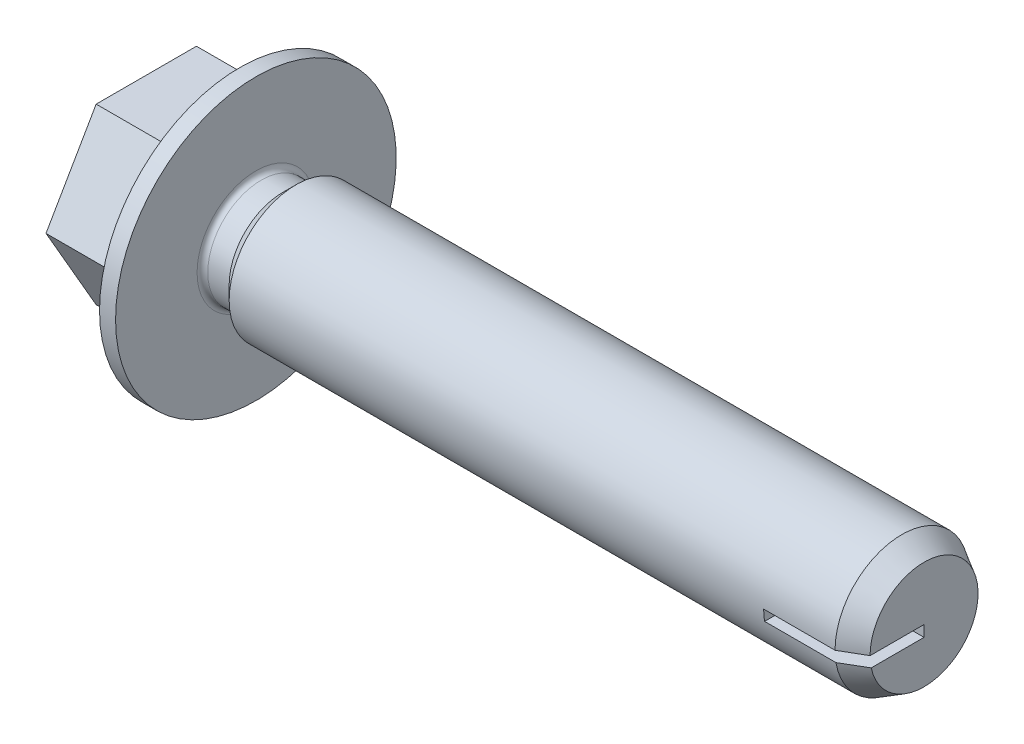
ISO-10303-21;
HEADER;
FILE_DESCRIPTION(('STEP AP214'),'2;1');
FILE_NAME('part.step','',(''),(''),'','','');
FILE_SCHEMA(('AUTOMOTIVE_DESIGN { 1 0 10303 214 1 1 1 1 }'));
ENDSEC;
DATA;
#1=APPLICATION_CONTEXT('core data for automotive mechanical design processes');
#2=APPLICATION_PROTOCOL_DEFINITION('international standard','automotive_design',2000,#1);
#3=PRODUCT_CONTEXT('',#1,'mechanical');
#4=PRODUCT('Part','Part','',(#3));
#5=PRODUCT_RELATED_PRODUCT_CATEGORY('part','',(#4));
#6=PRODUCT_DEFINITION_FORMATION('','',#4);
#7=PRODUCT_DEFINITION_CONTEXT('part definition',#1,'design');
#8=PRODUCT_DEFINITION('design','',#6,#7);
#9=PRODUCT_DEFINITION_SHAPE('','',#8);
#10=(LENGTH_UNIT() NAMED_UNIT(*) SI_UNIT(.MILLI.,.METRE.));
#11=(NAMED_UNIT(*) PLANE_ANGLE_UNIT() SI_UNIT($,.RADIAN.));
#12=(NAMED_UNIT(*) SI_UNIT($,.STERADIAN.) SOLID_ANGLE_UNIT());
#13=UNCERTAINTY_MEASURE_WITH_UNIT(LENGTH_MEASURE(1.E-05),#10,'distance_accuracy_value','');
#14=(GEOMETRIC_REPRESENTATION_CONTEXT(3) GLOBAL_UNCERTAINTY_ASSIGNED_CONTEXT((#13)) GLOBAL_UNIT_ASSIGNED_CONTEXT((#10,
#11,#12)) REPRESENTATION_CONTEXT('',''));
#15=CARTESIAN_POINT('',(0.,0.,0.));
#16=DIRECTION('',(0.,0.,1.));
#17=DIRECTION('',(1.,0.,0.));
#18=AXIS2_PLACEMENT_3D('',#15,#16,#17);
#19=CARTESIAN_POINT('',(0.,0.,0.));
#20=DIRECTION('',(-1.,0.,0.));
#21=DIRECTION('',(0.,0.,1.));
#22=AXIS2_PLACEMENT_3D('',#19,#20,#21);
#23=CYLINDRICAL_SURFACE('',#22,5.00000000000001);
#24=CARTESIAN_POINT('',(3.,0.,0.));
#25=DIRECTION('',(-1.,0.,0.));
#26=DIRECTION('',(0.,0.,1.));
#27=AXIS2_PLACEMENT_3D('',#24,#25,#26);
#28=CIRCLE('',#27,5.);
#29=CARTESIAN_POINT('',(3.,0.,5.));
#30=VERTEX_POINT('',#29);
#31=EDGE_CURVE('E257',#30,#30,#28,.T.);
#32=ORIENTED_EDGE('',*,*,#31,.F.);
#33=EDGE_LOOP('',(#32));
#34=FACE_BOUND('',#33,.T.);
#35=DIRECTION('',(-1.,0.,0.));
#36=VECTOR('',#35,1.);
#37=CARTESIAN_POINT('',(0.,0.,5.00000000000001));
#38=LINE('',#37,#36);
#39=CARTESIAN_POINT('',(48.3372312247338,0.,5.));
#40=VERTEX_POINT('',#39);
#41=CARTESIAN_POINT('',(43.,0.,5.00000000000001));
#42=VERTEX_POINT('',#41);
#43=EDGE_CURVE('E393',#40,#42,#38,.T.);
#44=ORIENTED_EDGE('',*,*,#43,.F.);
#45=CARTESIAN_POINT('',(48.3372312247338,0.,0.));
#46=DIRECTION('',(-1.,0.,0.));
#47=DIRECTION('',(0.,0.,1.));
#48=AXIS2_PLACEMENT_3D('',#45,#46,#47);
#49=CIRCLE('',#48,5.);
#50=CARTESIAN_POINT('',(48.3372312247338,-0.833333333333333,4.93006648591635));
#51=VERTEX_POINT('',#50);
#52=EDGE_CURVE('E388',#40,#51,#49,.T.);
#53=ORIENTED_EDGE('',*,*,#52,.T.);
#54=DIRECTION('',(-1.,0.,0.));
#55=VECTOR('',#54,1.);
#56=CARTESIAN_POINT('',(0.,-0.833333333333339,4.93006648591635));
#57=LINE('',#56,#55);
#58=CARTESIAN_POINT('',(43.,-0.833333333333334,4.93006648591636));
#59=VERTEX_POINT('',#58);
#60=EDGE_CURVE('E397',#59,#51,#57,.F.);
#61=ORIENTED_EDGE('',*,*,#60,.F.);
#62=CARTESIAN_POINT('',(43.,0.,0.));
#63=DIRECTION('',(1.,0.,0.));
#64=DIRECTION('',(0.,0.,-1.));
#65=AXIS2_PLACEMENT_3D('',#62,#63,#64);
#66=CIRCLE('',#65,5.00000000000001);
#67=EDGE_CURVE('E126',#42,#59,#66,.T.);
#68=ORIENTED_EDGE('',*,*,#67,.F.);
#69=EDGE_LOOP('',(#44,#53,#61,#68));
#70=FACE_BOUND('',#69,.T.);
#71=ADVANCED_FACE('F153',(#34,#70),#23,.T.);
#72=CARTESIAN_POINT('',(48.3372312247338,0.,0.));
#73=DIRECTION('',(-1.,0.,0.));
#74=DIRECTION('',(0.,0.,1.));
#75=AXIS2_PLACEMENT_3D('',#72,#73,#74);
#76=CONICAL_SURFACE('',#75,5.,0.523598775598293);
#77=ORIENTED_EDGE('',*,*,#52,.F.);
#78=DIRECTION('',(-0.866025403784442,0.,0.499999999999995));
#79=VECTOR('',#78,1.);
#80=CARTESIAN_POINT('',(56.9974852625784,0.,0.));
#81=LINE('',#80,#79);
#82=CARTESIAN_POINT('',(50.,0.,4.04));
#83=VERTEX_POINT('',#82);
#84=EDGE_CURVE('E395',#40,#83,#81,.F.);
#85=ORIENTED_EDGE('',*,*,#84,.T.);
#86=CARTESIAN_POINT('',(50.,0.,0.));
#87=DIRECTION('',(-1.,0.,0.));
#88=DIRECTION('',(0.,0.,1.));
#89=AXIS2_PLACEMENT_3D('',#86,#87,#88);
#90=CIRCLE('',#89,4.04);
#91=CARTESIAN_POINT('',(50.,-0.833333333333333,3.95311972441458));
#92=VERTEX_POINT('',#91);
#93=EDGE_CURVE('E255',#83,#92,#90,.T.);
#94=ORIENTED_EDGE('',*,*,#93,.T.);
#95=CARTESIAN_POINT('',(54.3247639619559,-0.833333333333332,1.29873089558837));
#96=CARTESIAN_POINT('',(54.2539941704602,-0.833333333333332,1.34725537138206));
#97=CARTESIAN_POINT('',(54.1828785114112,-0.833333333333332,1.39526964887625));
#98=CARTESIAN_POINT('',(54.0401016315832,-0.833333333333332,1.49047344700938));
#99=CARTESIAN_POINT('',(53.9684404371539,-0.833333333333333,1.53766300712429));
#100=CARTESIAN_POINT('',(53.8247211543455,-0.833333333333333,1.63141155391442));
#101=CARTESIAN_POINT('',(53.752663118618,-0.833333333333333,1.67797062153481));
#102=CARTESIAN_POINT('',(53.6082258623107,-0.833333333333333,1.77058968692906));
#103=CARTESIAN_POINT('',(53.5358466372734,-0.833333333333333,1.81664967774571));
#104=CARTESIAN_POINT('',(53.3183642112331,-0.833333333333333,1.95421200872291));
#105=CARTESIAN_POINT('',(53.1728838142965,-0.833333333333333,2.04511773162646));
#106=CARTESIAN_POINT('',(52.8812495364593,-0.833333333333333,2.22585256137803));
#107=CARTESIAN_POINT('',(52.7350956278255,-0.833333333333333,2.31568162333398));
#108=CARTESIAN_POINT('',(52.3080852699756,-0.833333333333333,2.57660770394159));
#109=CARTESIAN_POINT('',(52.026608833395,-0.833333333333333,2.74668927298442));
#110=CARTESIAN_POINT('',(51.4627141115084,-0.833333333333333,3.08527145364158));
#111=CARTESIAN_POINT('',(51.1802958355546,-0.833333333333333,3.25377208089117));
#112=CARTESIAN_POINT('',(50.6148051769543,-0.833333333333333,3.58980112792525));
#113=CARTESIAN_POINT('',(50.3317326746538,-0.833333333333333,3.7573293462797));
#114=CARTESIAN_POINT('',(49.7651904009645,-0.833333333333333,4.09171283682867));
#115=CARTESIAN_POINT('',(49.4817206290751,-0.833333333333333,4.2585681081745));
#116=CARTESIAN_POINT('',(48.7666378111783,-0.833333333333333,4.67868104235534));
#117=CARTESIAN_POINT('',(48.3348433243252,-0.833333333333333,4.93162979117259));
#118=CARTESIAN_POINT('',(47.4708588506733,-0.833333333333333,5.43685048612455));
#119=CARTESIAN_POINT('',(47.038668863839,-0.833333333333333,5.68912243219863));
#120=CARTESIAN_POINT('',(46.174190792108,-0.833333333333334,6.19311639762207));
#121=CARTESIAN_POINT('',(45.7419028086198,-0.833333333333334,6.44483859095241));
#122=CARTESIAN_POINT('',(44.8771371202499,-0.833333333333334,6.94795546546835));
#123=CARTESIAN_POINT('',(44.4446594156462,-0.833333333333334,7.19935014713161));
#124=CARTESIAN_POINT('',(44.0121233168639,-0.833333333333334,7.45064407792756));
#125=B_SPLINE_CURVE_WITH_KNOTS('',3,(#95,#96,#97,#98,#99,#100,#101,#102,#103,#104,#105,#106,
#107,#108,#109,#110,#111,#112,#113,#114,#115,#116,#117,#118,#119,#120,#121,#122,#123,#124),
.UNSPECIFIED.,.F.,.F.,(4,2,2,2,2,2,2,2,2,2,2,2,2,2,4),(0.,0.257416666427779,0.514820977404485,
0.772191922352455,1.0295664504941,1.54419953035658,2.05885399404563,3.04545828859048,
4.03205281546699,5.01884489709277,6.00563822283813,7.50692516636697,9.00821224437488,
10.5089227938863,12.0096311523225),.UNSPECIFIED.);
#126=EDGE_CURVE('E399',#92,#51,#125,.T.);
#127=ORIENTED_EDGE('',*,*,#126,.T.);
#128=EDGE_LOOP('',(#77,#85,#94,#127));
#129=FACE_BOUND('',#128,.T.);
#130=ADVANCED_FACE('F407',(#129),#76,.T.);
#131=CARTESIAN_POINT('',(50.,5.00000000000001,0.));
#132=DIRECTION('',(-1.,0.,0.));
#133=DIRECTION('',(0.,0.,1.));
#134=AXIS2_PLACEMENT_3D('',#131,#132,#133);
#135=PLANE('',#134);
#136=DIRECTION('',(0.,0.,1.));
#137=VECTOR('',#136,1.);
#138=CARTESIAN_POINT('',(50.,0.,0.));
#139=LINE('',#138,#137);
#140=CARTESIAN_POINT('',(50.,0.,0.));
#141=VERTEX_POINT('',#140);
#142=EDGE_CURVE('E161',#141,#83,#139,.T.);
#143=ORIENTED_EDGE('',*,*,#142,.F.);
#144=DIRECTION('',(0.,1.,0.));
#145=VECTOR('',#144,1.);
#146=CARTESIAN_POINT('',(50.,0.,0.));
#147=LINE('',#146,#145);
#148=CARTESIAN_POINT('',(50.,-0.833333333333334,0.));
#149=VERTEX_POINT('',#148);
#150=EDGE_CURVE('E245',#149,#141,#147,.T.);
#151=ORIENTED_EDGE('',*,*,#150,.F.);
#152=DIRECTION('',(0.,0.,-1.));
#153=VECTOR('',#152,1.);
#154=CARTESIAN_POINT('',(50.,-0.833333333333333,0.));
#155=LINE('',#154,#153);
#156=EDGE_CURVE('E256',#92,#149,#155,.T.);
#157=ORIENTED_EDGE('',*,*,#156,.F.);
#158=ORIENTED_EDGE('',*,*,#93,.F.);
#159=EDGE_LOOP('',(#143,#151,#157,#158));
#160=FACE_BOUND('',#159,.T.);
#161=ADVANCED_FACE('F253',(#160),#135,.F.);
#162=CARTESIAN_POINT('',(-8.2,6.5,0.));
#163=DIRECTION('',(1.,0.,0.));
#164=DIRECTION('',(0.,0.,-1.));
#165=AXIS2_PLACEMENT_3D('',#162,#163,#164);
#166=PLANE('',#165);
#167=DIRECTION('',(0.,-0.866025403784439,-0.5));
#168=VECTOR('',#167,1.);
#169=CARTESIAN_POINT('',(-8.2,3.25,-5.62916512459885));
#170=LINE('',#169,#168);
#171=CARTESIAN_POINT('',(-8.2,6.5,-3.75277674973257));
#172=VERTEX_POINT('',#171);
#173=CARTESIAN_POINT('',(-8.2,0.,-7.50555349946513));
#174=VERTEX_POINT('',#173);
#175=EDGE_CURVE('E280',#172,#174,#170,.T.);
#176=ORIENTED_EDGE('',*,*,#175,.T.);
#177=DIRECTION('',(0.,-0.866025403784439,0.5));
#178=VECTOR('',#177,1.);
#179=CARTESIAN_POINT('',(-8.2,-3.25,-5.62916512459885));
#180=LINE('',#179,#178);
#181=CARTESIAN_POINT('',(-8.2,-6.5,-3.75277674973257));
#182=VERTEX_POINT('',#181);
#183=EDGE_CURVE('E354',#174,#182,#180,.T.);
#184=ORIENTED_EDGE('',*,*,#183,.T.);
#185=DIRECTION('',(0.,0.,1.));
#186=VECTOR('',#185,1.);
#187=CARTESIAN_POINT('',(-8.2,-6.5,0.));
#188=LINE('',#187,#186);
#189=CARTESIAN_POINT('',(-8.2,-6.5,3.75277674973257));
#190=VERTEX_POINT('',#189);
#191=EDGE_CURVE('E383',#182,#190,#188,.T.);
#192=ORIENTED_EDGE('',*,*,#191,.T.);
#193=DIRECTION('',(0.,0.866025403784439,0.5));
#194=VECTOR('',#193,1.);
#195=CARTESIAN_POINT('',(-8.2,-6.5,3.75277674973257));
#196=LINE('',#195,#194);
#197=CARTESIAN_POINT('',(-8.2,0.,7.50555349946513));
#198=VERTEX_POINT('',#197);
#199=EDGE_CURVE('E352',#190,#198,#196,.T.);
#200=ORIENTED_EDGE('',*,*,#199,.T.);
#201=DIRECTION('',(0.,0.866025403784439,-0.5));
#202=VECTOR('',#201,1.);
#203=CARTESIAN_POINT('',(-8.2,0.,7.50555349946513));
#204=LINE('',#203,#202);
#205=CARTESIAN_POINT('',(-8.2,6.5,3.75277674973257));
#206=VERTEX_POINT('',#205);
#207=EDGE_CURVE('E322',#198,#206,#204,.T.);
#208=ORIENTED_EDGE('',*,*,#207,.T.);
#209=DIRECTION('',(0.,0.,-1.));
#210=VECTOR('',#209,1.);
#211=CARTESIAN_POINT('',(-8.2,6.5,0.));
#212=LINE('',#211,#210);
#213=EDGE_CURVE('E277',#206,#172,#212,.T.);
#214=ORIENTED_EDGE('',*,*,#213,.T.);
#215=EDGE_LOOP('',(#176,#184,#192,#200,#208,#214));
#216=FACE_BOUND('',#215,.T.);
#217=ADVANCED_FACE('F155',(#216),#166,.F.);
#218=CARTESIAN_POINT('',(3.,0.,0.));
#219=DIRECTION('',(1.,0.,0.));
#220=DIRECTION('',(0.,0.,-1.));
#221=AXIS2_PLACEMENT_3D('',#218,#219,#220);
#222=CONICAL_SURFACE('',#221,5.,0.785398163397449);
#223=CARTESIAN_POINT('',(2.,0.,0.));
#224=DIRECTION('',(-1.,0.,0.));
#225=DIRECTION('',(0.,0.,1.));
#226=AXIS2_PLACEMENT_3D('',#223,#224,#225);
#227=CIRCLE('',#226,4.);
#228=CARTESIAN_POINT('',(2.,0.,4.));
#229=VERTEX_POINT('',#228);
#230=EDGE_CURVE('E262',#229,#229,#227,.T.);
#231=ORIENTED_EDGE('',*,*,#230,.F.);
#232=EDGE_LOOP('',(#231));
#233=FACE_BOUND('',#232,.T.);
#234=ORIENTED_EDGE('',*,*,#31,.T.);
#235=EDGE_LOOP('',(#234));
#236=FACE_BOUND('',#235,.T.);
#237=ADVANCED_FACE('F432',(#233,#236),#222,.T.);
#238=CARTESIAN_POINT('',(0.,0.,0.));
#239=DIRECTION('',(-1.,0.,0.));
#240=DIRECTION('',(0.,0.,1.));
#241=AXIS2_PLACEMENT_3D('',#238,#239,#240);
#242=CYLINDRICAL_SURFACE('',#241,4.);
#243=CARTESIAN_POINT('',(0.4,0.,0.));
#244=DIRECTION('',(-1.,0.,0.));
#245=DIRECTION('',(0.,0.,1.));
#246=AXIS2_PLACEMENT_3D('',#243,#244,#245);
#247=CIRCLE('',#246,4.);
#248=CARTESIAN_POINT('',(0.4,0.,4.));
#249=VERTEX_POINT('',#248);
#250=EDGE_CURVE('E265',#249,#249,#247,.T.);
#251=ORIENTED_EDGE('',*,*,#250,.F.);
#252=EDGE_LOOP('',(#251));
#253=FACE_BOUND('',#252,.T.);
#254=ORIENTED_EDGE('',*,*,#230,.T.);
#255=EDGE_LOOP('',(#254));
#256=FACE_BOUND('',#255,.T.);
#257=ADVANCED_FACE('F441',(#253,#256),#242,.T.);
#258=CARTESIAN_POINT('',(0.4,0.,0.));
#259=DIRECTION('',(-1.,0.,0.));
#260=DIRECTION('',(0.,0.,1.));
#261=AXIS2_PLACEMENT_3D('',#258,#259,#260);
#262=TOROIDAL_SURFACE('',#261,4.4,0.4);
#263=CARTESIAN_POINT('',(0.,0.,0.));
#264=DIRECTION('',(-1.,0.,0.));
#265=DIRECTION('',(0.,0.,1.));
#266=AXIS2_PLACEMENT_3D('',#263,#264,#265);
#267=CIRCLE('',#266,4.4);
#268=CARTESIAN_POINT('',(0.,0.,4.4));
#269=VERTEX_POINT('',#268);
#270=EDGE_CURVE('E268',#269,#269,#267,.T.);
#271=ORIENTED_EDGE('',*,*,#270,.F.);
#272=EDGE_LOOP('',(#271));
#273=FACE_BOUND('',#272,.T.);
#274=ORIENTED_EDGE('',*,*,#250,.T.);
#275=EDGE_LOOP('',(#274));
#276=FACE_BOUND('',#275,.T.);
#277=ADVANCED_FACE('F446',(#273,#276),#262,.F.);
#278=CARTESIAN_POINT('',(0.,10.5,0.));
#279=DIRECTION('',(-1.,0.,0.));
#280=DIRECTION('',(0.,0.,1.));
#281=AXIS2_PLACEMENT_3D('',#278,#279,#280);
#282=PLANE('',#281);
#283=CARTESIAN_POINT('',(0.,0.,0.));
#284=DIRECTION('',(-1.,0.,0.));
#285=DIRECTION('',(0.,0.,1.));
#286=AXIS2_PLACEMENT_3D('',#283,#284,#285);
#287=CIRCLE('',#286,10.5);
#288=CARTESIAN_POINT('',(0.,0.,10.5));
#289=VERTEX_POINT('',#288);
#290=EDGE_CURVE('E271',#289,#289,#287,.T.);
#291=ORIENTED_EDGE('',*,*,#290,.F.);
#292=EDGE_LOOP('',(#291));
#293=FACE_BOUND('',#292,.T.);
#294=ORIENTED_EDGE('',*,*,#270,.T.);
#295=EDGE_LOOP('',(#294));
#296=FACE_BOUND('',#295,.T.);
#297=ADVANCED_FACE('F454',(#293,#296),#282,.F.);
#298=CARTESIAN_POINT('',(0.,0.,0.));
#299=DIRECTION('',(-1.,0.,0.));
#300=DIRECTION('',(0.,0.,1.));
#301=AXIS2_PLACEMENT_3D('',#298,#299,#300);
#302=CYLINDRICAL_SURFACE('',#301,10.5);
#303=CARTESIAN_POINT('',(-1.2,0.,0.));
#304=DIRECTION('',(-1.,0.,0.));
#305=DIRECTION('',(0.,0.,1.));
#306=AXIS2_PLACEMENT_3D('',#303,#304,#305);
#307=CIRCLE('',#306,10.5);
#308=CARTESIAN_POINT('',(-1.2,0.,10.5));
#309=VERTEX_POINT('',#308);
#310=EDGE_CURVE('E274',#309,#309,#307,.T.);
#311=ORIENTED_EDGE('',*,*,#310,.F.);
#312=EDGE_LOOP('',(#311));
#313=FACE_BOUND('',#312,.T.);
#314=ORIENTED_EDGE('',*,*,#290,.T.);
#315=EDGE_LOOP('',(#314));
#316=FACE_BOUND('',#315,.T.);
#317=ADVANCED_FACE('F461',(#313,#316),#302,.T.);
#318=CARTESIAN_POINT('',(-1.2,0.,0.));
#319=DIRECTION('',(1.,0.,0.));
#320=DIRECTION('',(0.,0.,-1.));
#321=AXIS2_PLACEMENT_3D('',#318,#319,#320);
#322=CONICAL_SURFACE('',#321,10.5,1.25663706143592);
#323=CARTESIAN_POINT('',(-2.17291712797886,0.000199999999997582,-7.50566896951897));
#324=CARTESIAN_POINT('',(-2.22349525444982,-0.26930981703676,-7.35006740410355));
#325=CARTESIAN_POINT('',(-2.26946409694828,-0.539532374949047,-7.19405433755179));
#326=CARTESIAN_POINT('',(-2.35029036355931,-1.08137897615164,-6.88121905648799));
#327=CARTESIAN_POINT('',(-2.38514098848235,-1.35300377419353,-6.72439640621992));
#328=CARTESIAN_POINT('',(-2.44155750313786,-1.89524421670215,-6.41133374077206));
#329=CARTESIAN_POINT('',(-2.46322182119858,-2.16585196905309,-6.25509828210745));
#330=CARTESIAN_POINT('',(-2.4922785692835,-2.70757323491959,-5.94233536343368));
#331=CARTESIAN_POINT('',(-2.49967517351365,-2.97868657727647,-5.78580800224304));
#332=CARTESIAN_POINT('',(-2.49968239412393,-3.52094649134037,-5.4727340948875));
#333=CARTESIAN_POINT('',(-2.49229120689731,-3.79209306306701,-5.31618754871129));
#334=CARTESIAN_POINT('',(-2.46324141354804,-4.3338808651593,-5.00338621532964));
#335=CARTESIAN_POINT('',(-2.44157863090574,-4.60452192433128,-4.84713152696294));
#336=CARTESIAN_POINT('',(-2.38516158355131,-5.14682930258442,-4.53403021614497));
#337=CARTESIAN_POINT('',(-2.35030885137534,-5.41848772725515,-4.37718815153369));
#338=CARTESIAN_POINT('',(-2.26947539840536,-5.96040124298641,-4.06431423734875));
#339=CARTESIAN_POINT('',(-2.22350147997238,-6.23065708912292,-3.90828195183177));
#340=CARTESIAN_POINT('',(-2.17291712797886,-6.5002,-3.75266127967873));
#341=B_SPLINE_CURVE_WITH_KNOTS('',3,(#323,#324,#325,#326,#327,#328,#329,#330,#331,#332,#333,
#334,#335,#336,#337,#338,#339,#340),.UNSPECIFIED.,.F.,.F.,(4,2,2,2,2,2,2,2,4),(0.,
0.945934908802724,1.89244718682318,2.83180475429616,3.7708874587428,4.71008470626822,
5.64955692790202,6.59618558731393,7.54223669144337),.UNSPECIFIED.);
#342=CARTESIAN_POINT('',(-2.1729546473395,0.,-7.50555349946517));
#343=VERTEX_POINT('',#342);
#344=CARTESIAN_POINT('',(-2.17295464733876,-6.5,-3.75277674973257));
#345=VERTEX_POINT('',#344);
#346=EDGE_CURVE('E315',#343,#345,#341,.T.);
#347=ORIENTED_EDGE('',*,*,#346,.F.);
#348=CARTESIAN_POINT('',(-2.17291712797886,6.5002,-3.75266127967873));
#349=CARTESIAN_POINT('',(-2.22350147997238,6.23065708912292,-3.90828195183177));
#350=CARTESIAN_POINT('',(-2.26947539840536,5.96040124298641,-4.06431423734875));
#351=CARTESIAN_POINT('',(-2.35030885137534,5.41848772725515,-4.37718815153369));
#352=CARTESIAN_POINT('',(-2.38516158355131,5.14682930258442,-4.53403021614497));
#353=CARTESIAN_POINT('',(-2.44157863090574,4.60452192433127,-4.84713152696294));
#354=CARTESIAN_POINT('',(-2.46324141354804,4.3338808651593,-5.00338621532964));
#355=CARTESIAN_POINT('',(-2.49229120689731,3.792093063067,-5.31618754871129));
#356=CARTESIAN_POINT('',(-2.49968239412393,3.52094649134037,-5.4727340948875));
#357=CARTESIAN_POINT('',(-2.49967517351365,2.97868657727647,-5.78580800224304));
#358=CARTESIAN_POINT('',(-2.4922785692835,2.70757323491959,-5.94233536343368));
#359=CARTESIAN_POINT('',(-2.46322182119858,2.16585196905309,-6.25509828210745));
#360=CARTESIAN_POINT('',(-2.44155750313786,1.89524421670215,-6.41133374077206));
#361=CARTESIAN_POINT('',(-2.38514098848235,1.35300377419352,-6.72439640621992));
#362=CARTESIAN_POINT('',(-2.35029036355931,1.08137897615163,-6.88121905648799));
#363=CARTESIAN_POINT('',(-2.26946409694828,0.539532374949043,-7.19405433755178));
#364=CARTESIAN_POINT('',(-2.22349525444982,0.269309817036757,-7.35006740410355));
#365=CARTESIAN_POINT('',(-2.17291712797886,-0.000200000000001824,-7.50566896951897));
#366=B_SPLINE_CURVE_WITH_KNOTS('',3,(#348,#349,#350,#351,#352,#353,#354,#355,#356,#357,#358,
#359,#360,#361,#362,#363,#364,#365),.UNSPECIFIED.,.F.,.F.,(4,2,2,2,2,2,2,2,4),(0.,
0.946051104129437,1.89267976354135,2.83215198517516,3.77134923270057,4.71043193714721,
5.64978950462019,6.59630178264065,7.54223669144337),.UNSPECIFIED.);
#367=CARTESIAN_POINT('',(-2.17295464733946,6.5000000000001,-3.75277674973251));
#368=VERTEX_POINT('',#367);
#369=EDGE_CURVE('E176',#368,#343,#366,.T.);
#370=ORIENTED_EDGE('',*,*,#369,.F.);
#371=CARTESIAN_POINT('',(1.60844124299059,6.50000000000001,18.0062027851354));
#372=CARTESIAN_POINT('',(1.44013924515086,6.50000000000001,17.4553842478899));
#373=CARTESIAN_POINT('',(1.27258607605126,6.50000000000001,16.9043342120026));
#374=CARTESIAN_POINT('',(0.939594155122505,6.50000000000001,15.8015695524641));
#375=CARTESIAN_POINT('',(0.774155496929519,6.50000000000001,15.2498549005576));
#376=CARTESIAN_POINT('',(0.445796208925198,6.50000000000001,14.1448403421264));
#377=CARTESIAN_POINT('',(0.28287939994498,6.5,13.5915392980461));
#378=CARTESIAN_POINT('',(-0.0392205761995786,6.5,12.4838631709862));
#379=CARTESIAN_POINT('',(-0.198403835892278,6.5,11.929488114993));
#380=CARTESIAN_POINT('',(-0.513471733014211,6.5,10.8126512314813));
#381=CARTESIAN_POINT('',(-0.669294328040763,6.5,10.2501718548621));
#382=CARTESIAN_POINT('',(-0.973398274578378,6.5,9.12310904315372));
#383=CARTESIAN_POINT('',(-1.12167902173992,6.5,8.55852544332568));
#384=CARTESIAN_POINT('',(-1.33567960740085,6.5,7.70952369973118));
#385=CARTESIAN_POINT('',(-1.40560987063623,6.5,7.42616804759064));
#386=CARTESIAN_POINT('',(-1.54199706300355,6.5,6.85862406512394));
#387=CARTESIAN_POINT('',(-1.60845405375098,6.5,6.57443574966365));
#388=CARTESIAN_POINT('',(-1.73708783191706,6.5,6.00512119226099));
#389=CARTESIAN_POINT('',(-1.79926510565445,6.5,5.71999506075669));
#390=CARTESIAN_POINT('',(-1.91833829776548,6.5,5.14864740329866));
#391=CARTESIAN_POINT('',(-1.97523441054105,6.5,4.86242591806954));
#392=CARTESIAN_POINT('',(-2.09005349406396,6.5,4.24852557510682));
#393=CARTESIAN_POINT('',(-2.14700141888541,6.5,3.92066208829001));
#394=CARTESIAN_POINT('',(-2.25031290629676,6.5,3.2632502380666));
#395=CARTESIAN_POINT('',(-2.29667654103437,6.5,2.93370188616053));
#396=CARTESIAN_POINT('',(-2.37642936187933,6.5,2.27348547995711));
#397=CARTESIAN_POINT('',(-2.40983693941674,6.5,1.9428196899419));
#398=CARTESIAN_POINT('',(-2.4616320900086,6.5,1.28030506387978));
#399=CARTESIAN_POINT('',(-2.48002051393049,6.5,0.948456295921033));
#400=CARTESIAN_POINT('',(-2.50034093331858,6.5,0.285839721510378));
#401=CARTESIAN_POINT('',(-2.50235162943884,6.5,-0.0449256104831026));
#402=CARTESIAN_POINT('',(-2.48996217186722,6.5,-0.706147430379378));
#403=CARTESIAN_POINT('',(-2.47556168655688,6.5,-1.03660391190623));
#404=CARTESIAN_POINT('',(-2.43143306553004,6.5,-1.69682942049191));
#405=CARTESIAN_POINT('',(-2.40168821756855,6.5,-2.02659730356466));
#406=CARTESIAN_POINT('',(-2.32884293290694,6.5,-2.68466131333234));
#407=CARTESIAN_POINT('',(-2.2857410429161,6.5,-3.01295727593243));
#408=CARTESIAN_POINT('',(-2.18943118449417,6.5,-3.66146274080752));
#409=CARTESIAN_POINT('',(-2.1364378345731,6.5,-3.98170462708885));
#410=CARTESIAN_POINT('',(-2.02187729627113,6.5,-4.62063006389214));
#411=CARTESIAN_POINT('',(-1.96031021409368,6.5,-4.93931363366647));
#412=CARTESIAN_POINT('',(-1.83037015413214,6.5,-5.57524403396995));
#413=CARTESIAN_POINT('',(-1.76199788344352,6.5,-5.892491010195));
#414=CARTESIAN_POINT('',(-1.61986735033551,6.5,-6.52576738425449));
#415=CARTESIAN_POINT('',(-1.54610911068829,6.5,-6.84179678723094));
#416=CARTESIAN_POINT('',(-1.39348701882257,6.5,-7.47631387466048));
#417=CARTESIAN_POINT('',(-1.31457572661764,6.5,-7.79479009730735));
#418=CARTESIAN_POINT('',(-1.15328453157652,6.5,-8.43086300346954));
#419=CARTESIAN_POINT('',(-1.0709045988087,6.5,-8.74845967936984));
#420=CARTESIAN_POINT('',(-0.90345833968245,6.5,-9.38259205137097));
#421=CARTESIAN_POINT('',(-0.818394866074006,6.5,-9.69912850311012));
#422=CARTESIAN_POINT('',(-0.646009962584994,6.5,-10.3315701773993));
#423=CARTESIAN_POINT('',(-0.558688642016315,6.5,-10.6474754297136));
#424=CARTESIAN_POINT('',(-0.470488732367401,6.5,-10.9631312072542));
#425=B_SPLINE_CURVE_WITH_KNOTS('',3,(#371,#372,#373,#374,#375,#376,#377,#378,#379,#380,#381,
#382,#383,#384,#385,#386,#387,#388,#389,#390,#391,#392,#393,#394,#395,#396,#397,#398,#399,#400,
#401,#402,#403,#404,#405,#406,#407,#408,#409,#410,#411,#412,#413,#414,#415,#416,#417,#418,#419,
#420,#421,#422,#423,#424),.UNSPECIFIED.,.F.,.F.,(4,2,2,2,2,2,2,2,2,2,2,2,2,2,2,2,2,2,2,2,2,2,2,
2,2,2,4),(0.,1.72787478864695,3.45582582892835,5.18617937545119,6.91648999330229,
8.66745152952249,10.4185531548796,11.2941081560414,12.1696476196696,13.0450874279711,
13.920494998146,14.9186733598015,15.91684491718,16.913594314203,17.910287239305,
18.9021878671476,19.8941085385439,20.8871118440729,21.8802232296297,22.8538712021912,
23.827507115176,24.8010419675866,25.7745727040788,26.7588690890207,27.7431739694023,
28.7264655783015,29.7097096707173),.UNSPECIFIED.);
#426=CARTESIAN_POINT('',(-2.17295464733946,6.5,3.75277674973268));
#427=VERTEX_POINT('',#426);
#428=EDGE_CURVE('E290',#427,#368,#425,.T.);
#429=ORIENTED_EDGE('',*,*,#428,.F.);
#430=CARTESIAN_POINT('',(-2.17291712797886,-0.000200000000000474,7.50566896951897));
#431=CARTESIAN_POINT('',(-2.22349836720929,0.26932636395487,7.35005785073593));
#432=CARTESIAN_POINT('',(-2.26946974769266,0.539565565972973,7.19403517470518));
#433=CARTESIAN_POINT('',(-2.35029960757502,1.08144562442468,6.8811805770896));
#434=CARTESIAN_POINT('',(-2.38515128619879,1.35308723577207,6.72434821965508));
#435=CARTESIAN_POINT('',(-2.44156806742538,1.89536114614298,6.41126623152793));
#436=CARTESIAN_POINT('',(-2.46323161792298,2.16598555190341,6.25502115801286));
#437=CARTESIAN_POINT('',(-2.49228488899474,2.70774008589335,5.94223903197907));
#438=CARTESIAN_POINT('',(-2.49967878493163,2.97887004294668,5.78570207828896));
#439=CARTESIAN_POINT('',(-2.49967878493163,3.52112995705333,5.47262817090874));
#440=CARTESIAN_POINT('',(-2.49228488899474,3.79225991410665,5.31609121721863));
#441=CARTESIAN_POINT('',(-2.46323161792298,4.33401444809659,5.00330909118484));
#442=CARTESIAN_POINT('',(-2.44156806742538,4.60463885385702,4.84706401766978));
#443=CARTESIAN_POINT('',(-2.38515128619879,5.14691276422793,4.53398202954262));
#444=CARTESIAN_POINT('',(-2.35029960757502,5.41855437557532,4.3771496721081));
#445=CARTESIAN_POINT('',(-2.26946974769266,5.96043443402703,4.06429507449252));
#446=CARTESIAN_POINT('',(-2.22349836720929,6.23067363604513,3.90827239846177));
#447=CARTESIAN_POINT('',(-2.17291712797886,6.5002,3.75266127967873));
#448=B_SPLINE_CURVE_WITH_KNOTS('',3,(#430,#431,#432,#433,#434,#435,#436,#437,#438,#439,#440,
#441,#442,#443,#444,#445,#446,#447),.UNSPECIFIED.,.F.,.F.,(4,2,2,2,2,2,2,2,4),(0.,
0.94599300645601,1.89256347516382,2.8319783697279,3.77111834572528,4.71025832172267,
5.64967321628675,6.59624368499456,7.54223669145057),.UNSPECIFIED.);
#449=CARTESIAN_POINT('',(-2.17295464733946,0.,7.50555349946519));
#450=VERTEX_POINT('',#449);
#451=EDGE_CURVE('E307',#450,#427,#448,.T.);
#452=ORIENTED_EDGE('',*,*,#451,.F.);
#453=CARTESIAN_POINT('',(-2.17291712797886,-6.5002,3.75266127967873));
#454=CARTESIAN_POINT('',(-2.22349836720929,-6.23067363604513,3.90827239846178));
#455=CARTESIAN_POINT('',(-2.26946974769266,-5.96043443402703,4.06429507449252));
#456=CARTESIAN_POINT('',(-2.35029960757502,-5.41855437557532,4.3771496721081));
#457=CARTESIAN_POINT('',(-2.38515128619879,-5.14691276422793,4.53398202954262));
#458=CARTESIAN_POINT('',(-2.44156806742538,-4.60463885385702,4.84706401766978));
#459=CARTESIAN_POINT('',(-2.46323161792298,-4.33401444809659,5.00330909118484));
#460=CARTESIAN_POINT('',(-2.49228488899474,-3.79225991410665,5.31609121721864));
#461=CARTESIAN_POINT('',(-2.49967878493163,-3.52112995705332,5.47262817090874));
#462=CARTESIAN_POINT('',(-2.49967878493163,-2.97887004294668,5.78570207828896));
#463=CARTESIAN_POINT('',(-2.49228488899474,-2.70774008589335,5.94223903197907));
#464=CARTESIAN_POINT('',(-2.46323161792298,-2.16598555190341,6.25502115801286));
#465=CARTESIAN_POINT('',(-2.44156806742538,-1.89536114614298,6.41126623152793));
#466=CARTESIAN_POINT('',(-2.38515128619879,-1.35308723577207,6.72434821965509));
#467=CARTESIAN_POINT('',(-2.35029960757502,-1.08144562442468,6.8811805770896));
#468=CARTESIAN_POINT('',(-2.26946974769266,-0.539565565972972,7.19403517470519));
#469=CARTESIAN_POINT('',(-2.22349836720929,-0.269326363954869,7.35005785073593));
#470=CARTESIAN_POINT('',(-2.17291712797886,0.000200000000000866,7.50566896951897));
#471=B_SPLINE_CURVE_WITH_KNOTS('',3,(#453,#454,#455,#456,#457,#458,#459,#460,#461,#462,#463,
#464,#465,#466,#467,#468,#469,#470),.UNSPECIFIED.,.F.,.F.,(4,2,2,2,2,2,2,2,4),(0.,
0.94599300645601,1.89256347516382,2.8319783697279,3.77111834572528,4.71025832172267,
5.64967321628675,6.59624368499455,7.54223669145056),.UNSPECIFIED.);
#472=CARTESIAN_POINT('',(-2.17295464733876,-6.5,3.75277674973257));
#473=VERTEX_POINT('',#472);
#474=EDGE_CURVE('E345',#473,#450,#471,.T.);
#475=ORIENTED_EDGE('',*,*,#474,.F.);
#476=CARTESIAN_POINT('',(-0.470488732367513,-6.5,-10.9631312072538));
#477=CARTESIAN_POINT('',(-0.558688642016371,-6.5,-10.6474754297134));
#478=CARTESIAN_POINT('',(-0.646009962584993,-6.5,-10.3315701773993));
#479=CARTESIAN_POINT('',(-0.818394866073894,-6.5,-9.69912850311053));
#480=CARTESIAN_POINT('',(-0.903458339682284,-6.5,-9.38259205137159));
#481=CARTESIAN_POINT('',(-1.07090459880843,-6.5,-8.74845967937087));
#482=CARTESIAN_POINT('',(-1.1532845315762,-6.5,-8.43086300347077));
#483=CARTESIAN_POINT('',(-1.31457572661723,-6.5,-7.79479009730901));
#484=CARTESIAN_POINT('',(-1.39348701882212,-6.5,-7.47631387466234));
#485=CARTESIAN_POINT('',(-1.54610911068775,-6.5,-6.84179678723321));
#486=CARTESIAN_POINT('',(-1.61986735033494,-6.5,-6.52576738425696));
#487=CARTESIAN_POINT('',(-1.76199788344289,-6.5,-5.89249101019787));
#488=CARTESIAN_POINT('',(-1.83037015413149,-6.5,-5.57524403397302));
#489=CARTESIAN_POINT('',(-1.960310214093,-6.5,-4.93931363366995));
#490=CARTESIAN_POINT('',(-2.02187729627044,-6.5,-4.62063006389582));
#491=CARTESIAN_POINT('',(-2.13643783457241,-6.5,-3.98170462709293));
#492=CARTESIAN_POINT('',(-2.18943118449348,-6.5,-3.6614627408118));
#493=CARTESIAN_POINT('',(-2.28574104291552,-6.5,-3.01295727593669));
#494=CARTESIAN_POINT('',(-2.32884293290644,-6.5,-2.68466131333638));
#495=CARTESIAN_POINT('',(-2.4016882175682,-6.5,-2.02659730356825));
#496=CARTESIAN_POINT('',(-2.43143306552976,-6.5,-1.69682942049528));
#497=CARTESIAN_POINT('',(-2.47556168655674,-6.5,-1.03660391190914));
#498=CARTESIAN_POINT('',(-2.48996217186713,-6.5,-0.70614743038206));
#499=CARTESIAN_POINT('',(-2.50235162943883,-6.5,-0.0449256104853267));
#500=CARTESIAN_POINT('',(-2.50034093331861,-6.5,0.285839721508384));
#501=CARTESIAN_POINT('',(-2.48002051393057,-6.5,0.948456295919498));
#502=CARTESIAN_POINT('',(-2.46163209000868,-6.5,1.28030506387848));
#503=CARTESIAN_POINT('',(-2.40983693941682,-6.5,1.94281968994105));
#504=CARTESIAN_POINT('',(-2.3764293618794,-6.5,2.27348547995649));
#505=CARTESIAN_POINT('',(-2.2966765410344,-6.5,2.93370188616036));
#506=CARTESIAN_POINT('',(-2.25031290629675,-6.5,3.26325023806666));
#507=CARTESIAN_POINT('',(-2.14700141888533,-6.5,3.92066208829051));
#508=CARTESIAN_POINT('',(-2.09005349406384,-6.5,4.24852557510755));
#509=CARTESIAN_POINT('',(-1.975234410541,-6.5,4.86242591806981));
#510=CARTESIAN_POINT('',(-1.91833829776556,-6.5,5.14864740329824));
#511=CARTESIAN_POINT('',(-1.79926510565482,-6.5,5.71999506075492));
#512=CARTESIAN_POINT('',(-1.7370878319176,-6.5,6.00512119225854));
#513=CARTESIAN_POINT('',(-1.60845405375185,-6.5,6.57443574965986));
#514=CARTESIAN_POINT('',(-1.5419970630046,-6.5,6.85862406511948));
#515=CARTESIAN_POINT('',(-1.40560987063765,-6.5,7.42616804758485));
#516=CARTESIAN_POINT('',(-1.33567960740245,-6.5,7.70952369972472));
#517=CARTESIAN_POINT('',(-1.1216790217421,-6.5,8.55852544331722));
#518=CARTESIAN_POINT('',(-0.973398274580968,-6.5,9.12310904314393));
#519=CARTESIAN_POINT('',(-0.669294328044178,-6.5,10.2501718548497));
#520=CARTESIAN_POINT('',(-0.513471733018046,-6.5,10.8126512314675));
#521=CARTESIAN_POINT('',(-0.198403835896948,-6.5,11.9294881149766));
#522=CARTESIAN_POINT('',(-0.0392205762046634,-6.5,12.4838631709685));
#523=CARTESIAN_POINT('',(0.282879399939062,-6.5,13.591539298026));
#524=CARTESIAN_POINT('',(0.445796208918861,-6.5,14.1448403421049));
#525=CARTESIAN_POINT('',(0.774155496922345,-6.5,15.2498549005336));
#526=CARTESIAN_POINT('',(0.939594155114912,-6.5,15.8015695524388));
#527=CARTESIAN_POINT('',(1.27258607604284,-6.5,16.9043342119748));
#528=CARTESIAN_POINT('',(1.44013924514201,-6.5,17.4553842478608));
#529=CARTESIAN_POINT('',(1.60844124298132,-6.5,18.0062027851051));
#530=B_SPLINE_CURVE_WITH_KNOTS('',3,(#476,#477,#478,#479,#480,#481,#482,#483,#484,#485,#486,
#487,#488,#489,#490,#491,#492,#493,#494,#495,#496,#497,#498,#499,#500,#501,#502,#503,#504,#505,
#506,#507,#508,#509,#510,#511,#512,#513,#514,#515,#516,#517,#518,#519,#520,#521,#522,#523,#524,
#525,#526,#527,#528,#529),.UNSPECIFIED.,.F.,.F.,(4,2,2,2,2,2,2,2,2,2,2,2,2,2,2,2,2,2,2,2,2,2,2,
2,2,2,4),(0.,0.983244092415164,1.96653570131366,2.95084058169467,3.93513696663594,
4.90866770312752,5.88220255553744,6.85583846852168,7.82948644108259,8.82259782664013,
9.81560113216977,10.8075218035668,11.7994224314101,12.7961153565128,13.7928647535365,
14.7910363109156,15.7892146725718,16.6646222427447,17.540062051044,18.4156015146702,
19.2911565158299,21.0422581411828,22.7932196773989,24.5235302952459,26.2538838417648,
27.9818348820422,29.7097096706851),.UNSPECIFIED.);
#531=EDGE_CURVE('E377',#345,#473,#530,.T.);
#532=ORIENTED_EDGE('',*,*,#531,.F.);
#533=EDGE_LOOP('',(#347,#370,#429,#452,#475,#532));
#534=FACE_BOUND('',#533,.T.);
#535=ORIENTED_EDGE('',*,*,#310,.T.);
#536=EDGE_LOOP('',(#535));
#537=FACE_BOUND('',#536,.T.);
#538=ADVANCED_FACE('F342',(#534,#537),#322,.T.);
#539=CARTESIAN_POINT('',(500000.,6.5,0.));
#540=DIRECTION('',(0.,1.,0.));
#541=DIRECTION('',(0.,0.,1.));
#542=AXIS2_PLACEMENT_3D('',#539,#540,#541);
#543=PLANE('',#542);
#544=ORIENTED_EDGE('',*,*,#213,.F.);
#545=DIRECTION('',(-1.,0.,0.));
#546=VECTOR('',#545,1.);
#547=CARTESIAN_POINT('',(500000.,6.5,3.75277674973257));
#548=LINE('',#547,#546);
#549=EDGE_CURVE('E314',#427,#206,#548,.T.);
#550=ORIENTED_EDGE('',*,*,#549,.F.);
#551=ORIENTED_EDGE('',*,*,#428,.T.);
#552=DIRECTION('',(-1.,0.,0.));
#553=VECTOR('',#552,1.);
#554=CARTESIAN_POINT('',(500000.,6.5,-3.75277674973257));
#555=LINE('',#554,#553);
#556=EDGE_CURVE('E278',#368,#172,#555,.T.);
#557=ORIENTED_EDGE('',*,*,#556,.T.);
#558=EDGE_LOOP('',(#544,#550,#551,#557));
#559=FACE_BOUND('',#558,.T.);
#560=ADVANCED_FACE('F329',(#559),#543,.T.);
#561=CARTESIAN_POINT('',(500000.,3.25,-5.62916512459885));
#562=DIRECTION('',(0.,0.5,-0.866025403784439));
#563=DIRECTION('',(0.,0.866025403784439,0.5));
#564=AXIS2_PLACEMENT_3D('',#561,#562,#563);
#565=PLANE('',#564);
#566=ORIENTED_EDGE('',*,*,#556,.F.);
#567=ORIENTED_EDGE('',*,*,#369,.T.);
#568=DIRECTION('',(-1.,0.,0.));
#569=VECTOR('',#568,1.);
#570=CARTESIAN_POINT('',(500000.,0.,-7.50555349946513));
#571=LINE('',#570,#569);
#572=EDGE_CURVE('E333',#343,#174,#571,.T.);
#573=ORIENTED_EDGE('',*,*,#572,.T.);
#574=ORIENTED_EDGE('',*,*,#175,.F.);
#575=EDGE_LOOP('',(#566,#567,#573,#574));
#576=FACE_BOUND('',#575,.T.);
#577=ADVANCED_FACE('F296',(#576),#565,.T.);
#578=CARTESIAN_POINT('',(500000.,0.,7.50555349946513));
#579=DIRECTION('',(0.,0.5,0.866025403784439));
#580=DIRECTION('',(0.,-0.866025403784439,0.5));
#581=AXIS2_PLACEMENT_3D('',#578,#579,#580);
#582=PLANE('',#581);
#583=ORIENTED_EDGE('',*,*,#207,.F.);
#584=DIRECTION('',(-1.,0.,0.));
#585=VECTOR('',#584,1.);
#586=CARTESIAN_POINT('',(500000.,0.,7.50555349946513));
#587=LINE('',#586,#585);
#588=EDGE_CURVE('E339',#450,#198,#587,.T.);
#589=ORIENTED_EDGE('',*,*,#588,.F.);
#590=ORIENTED_EDGE('',*,*,#451,.T.);
#591=ORIENTED_EDGE('',*,*,#549,.T.);
#592=EDGE_LOOP('',(#583,#589,#590,#591));
#593=FACE_BOUND('',#592,.T.);
#594=ADVANCED_FACE('F303',(#593),#582,.T.);
#595=CARTESIAN_POINT('',(500000.,-6.5,0.));
#596=DIRECTION('',(0.,-1.,0.));
#597=DIRECTION('',(0.,0.,-1.));
#598=AXIS2_PLACEMENT_3D('',#595,#596,#597);
#599=PLANE('',#598);
#600=DIRECTION('',(-1.,0.,0.));
#601=VECTOR('',#600,1.);
#602=CARTESIAN_POINT('',(500000.,-6.5,-3.75277674973257));
#603=LINE('',#602,#601);
#604=EDGE_CURVE('E382',#345,#182,#603,.T.);
#605=ORIENTED_EDGE('',*,*,#604,.F.);
#606=ORIENTED_EDGE('',*,*,#531,.T.);
#607=DIRECTION('',(-1.,0.,0.));
#608=VECTOR('',#607,1.);
#609=CARTESIAN_POINT('',(500000.,-6.5,3.75277674973257));
#610=LINE('',#609,#608);
#611=EDGE_CURVE('E351',#473,#190,#610,.T.);
#612=ORIENTED_EDGE('',*,*,#611,.T.);
#613=ORIENTED_EDGE('',*,*,#191,.F.);
#614=EDGE_LOOP('',(#605,#606,#612,#613));
#615=FACE_BOUND('',#614,.T.);
#616=ADVANCED_FACE('F371',(#615),#599,.T.);
#617=CARTESIAN_POINT('',(500000.,-3.25,-5.62916512459885));
#618=DIRECTION('',(0.,-0.5,-0.866025403784438));
#619=DIRECTION('',(0.,0.866025403784439,-0.5));
#620=AXIS2_PLACEMENT_3D('',#617,#618,#619);
#621=PLANE('',#620);
#622=ORIENTED_EDGE('',*,*,#183,.F.);
#623=ORIENTED_EDGE('',*,*,#572,.F.);
#624=ORIENTED_EDGE('',*,*,#346,.T.);
#625=ORIENTED_EDGE('',*,*,#604,.T.);
#626=EDGE_LOOP('',(#622,#623,#624,#625));
#627=FACE_BOUND('',#626,.T.);
#628=ADVANCED_FACE('F367',(#627),#621,.T.);
#629=CARTESIAN_POINT('',(500000.,-6.5,3.75277674973257));
#630=DIRECTION('',(0.,-0.5,0.866025403784439));
#631=DIRECTION('',(0.,-0.866025403784439,-0.5));
#632=AXIS2_PLACEMENT_3D('',#629,#630,#631);
#633=PLANE('',#632);
#634=ORIENTED_EDGE('',*,*,#474,.T.);
#635=ORIENTED_EDGE('',*,*,#588,.T.);
#636=ORIENTED_EDGE('',*,*,#199,.F.);
#637=ORIENTED_EDGE('',*,*,#611,.F.);
#638=EDGE_LOOP('',(#634,#635,#636,#637));
#639=FACE_BOUND('',#638,.T.);
#640=ADVANCED_FACE('F348',(#639),#633,.T.);
#641=CARTESIAN_POINT('',(43.,0.,10.5));
#642=DIRECTION('',(1.,0.,0.));
#643=DIRECTION('',(0.,0.,-1.));
#644=AXIS2_PLACEMENT_3D('',#641,#642,#643);
#645=PLANE('',#644);
#646=ORIENTED_EDGE('',*,*,#67,.T.);
#647=DIRECTION('',(0.,0.,-1.));
#648=VECTOR('',#647,1.);
#649=CARTESIAN_POINT('',(43.,-0.833333333333334,10.5));
#650=LINE('',#649,#648);
#651=CARTESIAN_POINT('',(43.,-0.833333333333334,0.));
#652=VERTEX_POINT('',#651);
#653=EDGE_CURVE('E633',#59,#652,#650,.T.);
#654=ORIENTED_EDGE('',*,*,#653,.T.);
#655=DIRECTION('',(0.,-1.,0.));
#656=VECTOR('',#655,1.);
#657=CARTESIAN_POINT('',(43.,0.,0.));
#658=LINE('',#657,#656);
#659=CARTESIAN_POINT('',(43.,0.,0.));
#660=VERTEX_POINT('',#659);
#661=EDGE_CURVE('E244',#660,#652,#658,.T.);
#662=ORIENTED_EDGE('',*,*,#661,.F.);
#663=DIRECTION('',(0.,0.,-1.));
#664=VECTOR('',#663,1.);
#665=CARTESIAN_POINT('',(43.,0.,10.5));
#666=LINE('',#665,#664);
#667=EDGE_CURVE('E242',#42,#660,#666,.T.);
#668=ORIENTED_EDGE('',*,*,#667,.F.);
#669=EDGE_LOOP('',(#646,#654,#662,#668));
#670=FACE_BOUND('',#669,.T.);
#671=ADVANCED_FACE('F416',(#670),#645,.T.);
#672=CARTESIAN_POINT('',(50.,0.,10.5));
#673=DIRECTION('',(0.,-1.,0.));
#674=DIRECTION('',(1.,0.,0.));
#675=AXIS2_PLACEMENT_3D('',#672,#673,#674);
#676=PLANE('',#675);
#677=ORIENTED_EDGE('',*,*,#43,.T.);
#678=ORIENTED_EDGE('',*,*,#667,.T.);
#679=DIRECTION('',(-1.,0.,0.));
#680=VECTOR('',#679,1.);
#681=CARTESIAN_POINT('',(50.,0.,0.));
#682=LINE('',#681,#680);
#683=EDGE_CURVE('E237',#141,#660,#682,.T.);
#684=ORIENTED_EDGE('',*,*,#683,.F.);
#685=ORIENTED_EDGE('',*,*,#142,.T.);
#686=ORIENTED_EDGE('',*,*,#84,.F.);
#687=EDGE_LOOP('',(#677,#678,#684,#685,#686));
#688=FACE_BOUND('',#687,.T.);
#689=ADVANCED_FACE('F238',(#688),#676,.T.);
#690=CARTESIAN_POINT('',(50.,-0.833333333333333,10.5));
#691=DIRECTION('',(0.,1.,0.));
#692=DIRECTION('',(-1.,0.,0.));
#693=AXIS2_PLACEMENT_3D('',#690,#691,#692);
#694=PLANE('',#693);
#695=ORIENTED_EDGE('',*,*,#60,.T.);
#696=ORIENTED_EDGE('',*,*,#126,.F.);
#697=ORIENTED_EDGE('',*,*,#156,.T.);
#698=DIRECTION('',(1.,0.,0.));
#699=VECTOR('',#698,1.);
#700=CARTESIAN_POINT('',(50.,-0.833333333333333,0.));
#701=LINE('',#700,#699);
#702=EDGE_CURVE('E168',#652,#149,#701,.T.);
#703=ORIENTED_EDGE('',*,*,#702,.F.);
#704=ORIENTED_EDGE('',*,*,#653,.F.);
#705=EDGE_LOOP('',(#695,#696,#697,#703,#704));
#706=FACE_BOUND('',#705,.T.);
#707=ADVANCED_FACE('F410',(#706),#694,.T.);
#708=CARTESIAN_POINT('',(50.,-0.833333333333333,0.));
#709=DIRECTION('',(0.,0.,-1.));
#710=DIRECTION('',(-1.,0.,0.));
#711=AXIS2_PLACEMENT_3D('',#708,#709,#710);
#712=PLANE('',#711);
#713=ORIENTED_EDGE('',*,*,#150,.T.);
#714=ORIENTED_EDGE('',*,*,#683,.T.);
#715=ORIENTED_EDGE('',*,*,#661,.T.);
#716=ORIENTED_EDGE('',*,*,#702,.T.);
#717=EDGE_LOOP('',(#713,#714,#715,#716));
#718=FACE_BOUND('',#717,.T.);
#719=ADVANCED_FACE('F248',(#718),#712,.F.);
#720=CLOSED_SHELL('',(#71,#130,#161,#217,#237,#257,#277,#297,#317,#538,#560,#577,#594,#616,#628,
#640,#671,#689,#707,#719));
#721=MANIFOLD_SOLID_BREP('B7',#720);
#722=ADVANCED_BREP_SHAPE_REPRESENTATION('',(#18,#721),#14);
#723=SHAPE_DEFINITION_REPRESENTATION(#9,#722);
ENDSEC;
END-ISO-10303-21;
